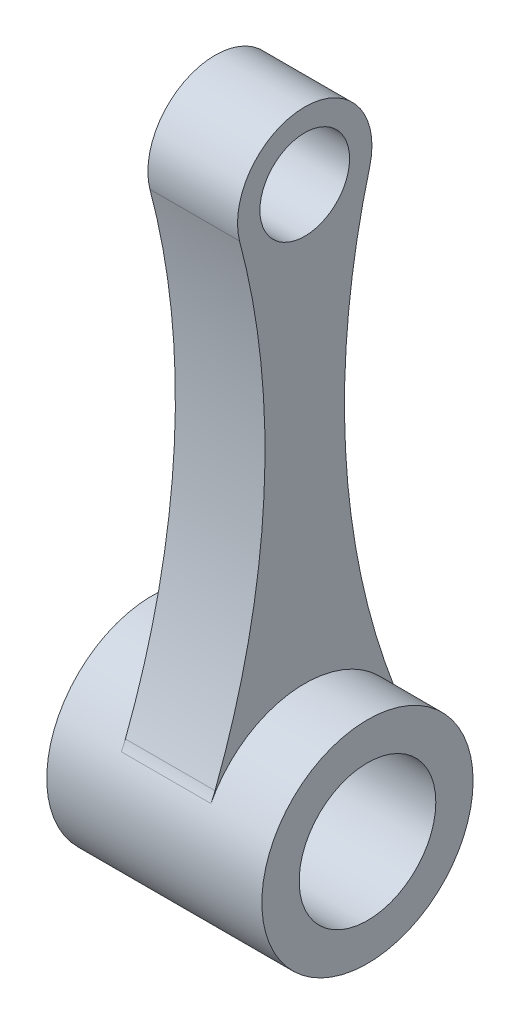
ISO-10303-21;
HEADER;
FILE_DESCRIPTION(('STEP AP214'),'2;1');
FILE_NAME('part.step','',(''),(''),'','','');
FILE_SCHEMA(('AUTOMOTIVE_DESIGN { 1 0 10303 214 1 1 1 1 }'));
ENDSEC;
DATA;
#1=APPLICATION_CONTEXT('core data for automotive mechanical design processes');
#2=APPLICATION_PROTOCOL_DEFINITION('international standard','automotive_design',2000,#1);
#3=PRODUCT_CONTEXT('',#1,'mechanical');
#4=PRODUCT('Part','Part','',(#3));
#5=PRODUCT_RELATED_PRODUCT_CATEGORY('part','',(#4));
#6=PRODUCT_DEFINITION_FORMATION('','',#4);
#7=PRODUCT_DEFINITION_CONTEXT('part definition',#1,'design');
#8=PRODUCT_DEFINITION('design','',#6,#7);
#9=PRODUCT_DEFINITION_SHAPE('','',#8);
#10=(LENGTH_UNIT() NAMED_UNIT(*) SI_UNIT(.MILLI.,.METRE.));
#11=(NAMED_UNIT(*) PLANE_ANGLE_UNIT() SI_UNIT($,.RADIAN.));
#12=(NAMED_UNIT(*) SI_UNIT($,.STERADIAN.) SOLID_ANGLE_UNIT());
#13=UNCERTAINTY_MEASURE_WITH_UNIT(LENGTH_MEASURE(1.E-05),#10,'distance_accuracy_value','');
#14=(GEOMETRIC_REPRESENTATION_CONTEXT(3) GLOBAL_UNCERTAINTY_ASSIGNED_CONTEXT((#13)) GLOBAL_UNIT_ASSIGNED_CONTEXT((#10,
#11,#12)) REPRESENTATION_CONTEXT('',''));
#15=CARTESIAN_POINT('',(0.,0.,0.));
#16=DIRECTION('',(0.,0.,1.));
#17=DIRECTION('',(1.,0.,0.));
#18=AXIS2_PLACEMENT_3D('',#15,#16,#17);
#19=CARTESIAN_POINT('',(12.,36.5210773560381,-88.4035011635025));
#20=DIRECTION('',(-1.,0.,0.));
#21=DIRECTION('',(0.,0.,1.));
#22=AXIS2_PLACEMENT_3D('',#19,#20,#21);
#23=CYLINDRICAL_SURFACE('',#22,83.9690692416678);
#24=DIRECTION('',(-1.,0.,0.));
#25=VECTOR('',#24,1.);
#26=CARTESIAN_POINT('',(12.,6.43103191721206,-10.010939304603));
#27=LINE('',#26,#25);
#28=CARTESIAN_POINT('',(5.,6.43103191721206,-10.010939304603));
#29=VERTEX_POINT('',#28);
#30=CARTESIAN_POINT('',(-5.,6.43103191721206,-10.010939304603));
#31=VERTEX_POINT('',#30);
#32=EDGE_CURVE('E111',#29,#31,#27,.T.);
#33=ORIENTED_EDGE('',*,*,#32,.T.);
#34=CARTESIAN_POINT('',(-5.,36.5210773560381,-88.4035011635025));
#35=DIRECTION('',(-1.,0.,0.));
#36=DIRECTION('',(0.,0.,1.));
#37=AXIS2_PLACEMENT_3D('',#34,#35,#36);
#38=CIRCLE('',#37,83.9690692416678);
#39=CARTESIAN_POINT('',(-5.,58.1783358251157,-7.27540649269463));
#40=VERTEX_POINT('',#39);
#41=EDGE_CURVE('E152',#40,#31,#38,.F.);
#42=ORIENTED_EDGE('',*,*,#41,.F.);
#43=DIRECTION('',(-1.,0.,0.));
#44=VECTOR('',#43,1.);
#45=CARTESIAN_POINT('',(12.,58.1783358251157,-7.27540649269463));
#46=LINE('',#45,#44);
#47=CARTESIAN_POINT('',(5.,58.1783358251157,-7.27540649269463));
#48=VERTEX_POINT('',#47);
#49=EDGE_CURVE('E114',#48,#40,#46,.T.);
#50=ORIENTED_EDGE('',*,*,#49,.F.);
#51=CARTESIAN_POINT('',(5.,36.5210773560381,-88.4035011635025));
#52=DIRECTION('',(1.,0.,0.));
#53=DIRECTION('',(0.,0.,-1.));
#54=AXIS2_PLACEMENT_3D('',#51,#52,#53);
#55=CIRCLE('',#54,83.9690692416678);
#56=EDGE_CURVE('E143',#29,#48,#55,.F.);
#57=ORIENTED_EDGE('',*,*,#56,.F.);
#58=EDGE_LOOP('',(#33,#42,#50,#57));
#59=FACE_BOUND('',#58,.T.);
#60=ADVANCED_FACE('F41',(#59),#23,.F.);
#61=CARTESIAN_POINT('',(12.,60.,0.));
#62=DIRECTION('',(-1.,0.,0.));
#63=DIRECTION('',(0.,0.,1.));
#64=AXIS2_PLACEMENT_3D('',#61,#62,#63);
#65=CYLINDRICAL_SURFACE('',#64,7.5);
#66=CARTESIAN_POINT('',(-5.,60.,0.));
#67=DIRECTION('',(-1.,0.,0.));
#68=DIRECTION('',(0.,0.,1.));
#69=AXIS2_PLACEMENT_3D('',#66,#67,#68);
#70=CIRCLE('',#69,7.5);
#71=CARTESIAN_POINT('',(-5.,58.1783358251157,7.27540649269463));
#72=VERTEX_POINT('',#71);
#73=EDGE_CURVE('E154',#72,#40,#70,.T.);
#74=ORIENTED_EDGE('',*,*,#73,.F.);
#75=DIRECTION('',(-1.,0.,0.));
#76=VECTOR('',#75,1.);
#77=CARTESIAN_POINT('',(12.,58.1783358251157,7.27540649269463));
#78=LINE('',#77,#76);
#79=CARTESIAN_POINT('',(5.,58.1783358251157,7.27540649269465));
#80=VERTEX_POINT('',#79);
#81=EDGE_CURVE('E119',#80,#72,#78,.T.);
#82=ORIENTED_EDGE('',*,*,#81,.F.);
#83=CARTESIAN_POINT('',(5.,60.,0.));
#84=DIRECTION('',(1.,0.,0.));
#85=DIRECTION('',(0.,0.,-1.));
#86=AXIS2_PLACEMENT_3D('',#83,#84,#85);
#87=CIRCLE('',#86,7.5);
#88=EDGE_CURVE('E141',#48,#80,#87,.T.);
#89=ORIENTED_EDGE('',*,*,#88,.F.);
#90=ORIENTED_EDGE('',*,*,#49,.T.);
#91=EDGE_LOOP('',(#74,#82,#89,#90));
#92=FACE_BOUND('',#91,.T.);
#93=ADVANCED_FACE('F160',(#92),#65,.T.);
#94=CARTESIAN_POINT('',(12.,36.5210773560381,88.4035011635025));
#95=DIRECTION('',(-1.,0.,0.));
#96=DIRECTION('',(0.,0.,1.));
#97=AXIS2_PLACEMENT_3D('',#94,#95,#96);
#98=CYLINDRICAL_SURFACE('',#97,83.9690692416678);
#99=CARTESIAN_POINT('',(-5.,36.5210773560381,88.4035011635025));
#100=DIRECTION('',(-1.,0.,0.));
#101=DIRECTION('',(0.,0.,1.));
#102=AXIS2_PLACEMENT_3D('',#99,#100,#101);
#103=CIRCLE('',#102,83.9690692416678);
#104=CARTESIAN_POINT('',(-5.,6.43103191721167,10.0109393046032));
#105=VERTEX_POINT('',#104);
#106=EDGE_CURVE('E107',#105,#72,#103,.F.);
#107=ORIENTED_EDGE('',*,*,#106,.F.);
#108=DIRECTION('',(-1.,0.,0.));
#109=VECTOR('',#108,1.);
#110=CARTESIAN_POINT('',(12.,6.43103191721168,10.0109393046032));
#111=LINE('',#110,#109);
#112=CARTESIAN_POINT('',(5.,6.43103191721168,10.0109393046032));
#113=VERTEX_POINT('',#112);
#114=EDGE_CURVE('E11',#105,#113,#111,.F.);
#115=ORIENTED_EDGE('',*,*,#114,.T.);
#116=CARTESIAN_POINT('',(5.,36.5210773560381,88.4035011635025));
#117=DIRECTION('',(1.,0.,0.));
#118=DIRECTION('',(0.,0.,-1.));
#119=AXIS2_PLACEMENT_3D('',#116,#117,#118);
#120=CIRCLE('',#119,83.9690692416678);
#121=EDGE_CURVE('E139',#80,#113,#120,.F.);
#122=ORIENTED_EDGE('',*,*,#121,.F.);
#123=ORIENTED_EDGE('',*,*,#81,.T.);
#124=EDGE_LOOP('',(#107,#115,#122,#123));
#125=FACE_BOUND('',#124,.T.);
#126=ADVANCED_FACE('F163',(#125),#98,.F.);
#127=CARTESIAN_POINT('',(12.,60.,0.));
#128=DIRECTION('',(-1.,0.,0.));
#129=DIRECTION('',(0.,0.,1.));
#130=AXIS2_PLACEMENT_3D('',#127,#128,#129);
#131=CYLINDRICAL_SURFACE('',#130,5.);
#132=CARTESIAN_POINT('',(5.,60.,0.));
#133=DIRECTION('',(1.,0.,0.));
#134=DIRECTION('',(0.,0.,-1.));
#135=AXIS2_PLACEMENT_3D('',#132,#133,#134);
#136=CIRCLE('',#135,5.);
#137=CARTESIAN_POINT('',(5.,60.,-5.));
#138=VERTEX_POINT('',#137);
#139=EDGE_CURVE('E134',#138,#138,#136,.F.);
#140=ORIENTED_EDGE('',*,*,#139,.F.);
#141=EDGE_LOOP('',(#140));
#142=FACE_BOUND('',#141,.T.);
#143=CARTESIAN_POINT('',(-5.,60.,0.));
#144=DIRECTION('',(-1.,0.,0.));
#145=DIRECTION('',(0.,0.,1.));
#146=AXIS2_PLACEMENT_3D('',#143,#144,#145);
#147=CIRCLE('',#146,5.);
#148=CARTESIAN_POINT('',(-5.,60.,5.));
#149=VERTEX_POINT('',#148);
#150=EDGE_CURVE('E148',#149,#149,#147,.F.);
#151=ORIENTED_EDGE('',*,*,#150,.F.);
#152=EDGE_LOOP('',(#151));
#153=FACE_BOUND('',#152,.T.);
#154=ADVANCED_FACE('F174',(#142,#153),#131,.F.);
#155=CARTESIAN_POINT('',(12.,10.0144997001197,-19.3468248356527));
#156=DIRECTION('',(-1.,0.,0.));
#157=DIRECTION('',(0.,0.,1.));
#158=AXIS2_PLACEMENT_3D('',#155,#156,#157);
#159=CYLINDRICAL_SURFACE('',#158,10.);
#160=CARTESIAN_POINT('',(-5.,10.0144997001197,-19.3468248356527));
#161=DIRECTION('',(-1.,0.,0.));
#162=DIRECTION('',(0.,0.,1.));
#163=AXIS2_PLACEMENT_3D('',#160,#161,#162);
#164=CIRCLE('',#163,10.);
#165=CARTESIAN_POINT('',(-5.,5.41754693117233,-10.4660576818496));
#166=VERTEX_POINT('',#165);
#167=EDGE_CURVE('E100',#31,#166,#164,.F.);
#168=ORIENTED_EDGE('',*,*,#167,.F.);
#169=ORIENTED_EDGE('',*,*,#32,.F.);
#170=CARTESIAN_POINT('',(5.,10.0144997001197,-19.3468248356527));
#171=DIRECTION('',(1.,0.,0.));
#172=DIRECTION('',(0.,0.,-1.));
#173=AXIS2_PLACEMENT_3D('',#170,#171,#172);
#174=CIRCLE('',#173,10.);
#175=CARTESIAN_POINT('',(5.,5.41754693117235,-10.4660576818497));
#176=VERTEX_POINT('',#175);
#177=EDGE_CURVE('E145',#176,#29,#174,.F.);
#178=ORIENTED_EDGE('',*,*,#177,.F.);
#179=DIRECTION('',(-1.,0.,0.));
#180=VECTOR('',#179,1.);
#181=CARTESIAN_POINT('',(12.,5.41754693117233,-10.4660576818496));
#182=LINE('',#181,#180);
#183=EDGE_CURVE('E49',#166,#176,#182,.F.);
#184=ORIENTED_EDGE('',*,*,#183,.F.);
#185=EDGE_LOOP('',(#168,#169,#178,#184));
#186=FACE_BOUND('',#185,.T.);
#187=ADVANCED_FACE('F171',(#186),#159,.F.);
#188=CARTESIAN_POINT('',(12.,10.0144997001194,19.3468248356528));
#189=DIRECTION('',(-1.,0.,0.));
#190=DIRECTION('',(0.,0.,1.));
#191=AXIS2_PLACEMENT_3D('',#188,#189,#190);
#192=CYLINDRICAL_SURFACE('',#191,10.);
#193=CARTESIAN_POINT('',(-5.,10.0144997001194,19.3468248356528));
#194=DIRECTION('',(-1.,0.,0.));
#195=DIRECTION('',(0.,0.,1.));
#196=AXIS2_PLACEMENT_3D('',#193,#194,#195);
#197=CIRCLE('',#196,10.);
#198=CARTESIAN_POINT('',(-5.,5.41754693117215,10.4660576818497));
#199=VERTEX_POINT('',#198);
#200=EDGE_CURVE('E98',#199,#105,#197,.F.);
#201=ORIENTED_EDGE('',*,*,#200,.F.);
#202=DIRECTION('',(-1.,0.,0.));
#203=VECTOR('',#202,1.);
#204=CARTESIAN_POINT('',(12.,5.41754693117216,10.4660576818497));
#205=LINE('',#204,#203);
#206=CARTESIAN_POINT('',(5.,5.41754693117216,10.4660576818497));
#207=VERTEX_POINT('',#206);
#208=EDGE_CURVE('E106',#207,#199,#205,.T.);
#209=ORIENTED_EDGE('',*,*,#208,.F.);
#210=CARTESIAN_POINT('',(5.,10.0144997001194,19.3468248356528));
#211=DIRECTION('',(1.,0.,0.));
#212=DIRECTION('',(0.,0.,-1.));
#213=AXIS2_PLACEMENT_3D('',#210,#211,#212);
#214=CIRCLE('',#213,10.);
#215=EDGE_CURVE('E137',#113,#207,#214,.F.);
#216=ORIENTED_EDGE('',*,*,#215,.F.);
#217=ORIENTED_EDGE('',*,*,#114,.F.);
#218=EDGE_LOOP('',(#201,#209,#216,#217));
#219=FACE_BOUND('',#218,.T.);
#220=ADVANCED_FACE('F43',(#219),#192,.F.);
#221=CARTESIAN_POINT('',(-12.,0.,0.));
#222=DIRECTION('',(1.,0.,0.));
#223=DIRECTION('',(0.,0.,-1.));
#224=AXIS2_PLACEMENT_3D('',#221,#222,#223);
#225=PLANE('',#224);
#226=CARTESIAN_POINT('',(-12.,0.,0.));
#227=DIRECTION('',(1.,0.,0.));
#228=DIRECTION('',(0.,0.,-1.));
#229=AXIS2_PLACEMENT_3D('',#226,#227,#228);
#230=CIRCLE('',#229,7.625);
#231=CARTESIAN_POINT('',(-12.,0.,-7.625));
#232=VERTEX_POINT('',#231);
#233=EDGE_CURVE('E128',#232,#232,#230,.T.);
#234=ORIENTED_EDGE('',*,*,#233,.T.);
#235=EDGE_LOOP('',(#234));
#236=FACE_BOUND('',#235,.T.);
#237=CARTESIAN_POINT('',(-12.,0.,0.));
#238=DIRECTION('',(1.,0.,0.));
#239=DIRECTION('',(0.,0.,-1.));
#240=AXIS2_PLACEMENT_3D('',#237,#238,#239);
#241=CIRCLE('',#240,11.7850828656933);
#242=CARTESIAN_POINT('',(-12.,0.,-11.7850828656933));
#243=VERTEX_POINT('',#242);
#244=EDGE_CURVE('E131',#243,#243,#241,.T.);
#245=ORIENTED_EDGE('',*,*,#244,.F.);
#246=EDGE_LOOP('',(#245));
#247=FACE_BOUND('',#246,.T.);
#248=ADVANCED_FACE('F179',(#236,#247),#225,.F.);
#249=CARTESIAN_POINT('',(12.,0.,0.));
#250=DIRECTION('',(1.,0.,0.));
#251=DIRECTION('',(0.,0.,-1.));
#252=AXIS2_PLACEMENT_3D('',#249,#250,#251);
#253=PLANE('',#252);
#254=CARTESIAN_POINT('',(12.,0.,0.));
#255=DIRECTION('',(1.,0.,0.));
#256=DIRECTION('',(0.,0.,-1.));
#257=AXIS2_PLACEMENT_3D('',#254,#255,#256);
#258=CIRCLE('',#257,7.625);
#259=CARTESIAN_POINT('',(12.,0.,-7.625));
#260=VERTEX_POINT('',#259);
#261=EDGE_CURVE('E122',#260,#260,#258,.T.);
#262=ORIENTED_EDGE('',*,*,#261,.F.);
#263=EDGE_LOOP('',(#262));
#264=FACE_BOUND('',#263,.T.);
#265=CARTESIAN_POINT('',(12.,0.,0.));
#266=DIRECTION('',(1.,0.,0.));
#267=DIRECTION('',(0.,0.,-1.));
#268=AXIS2_PLACEMENT_3D('',#265,#266,#267);
#269=CIRCLE('',#268,11.7850828656933);
#270=CARTESIAN_POINT('',(12.,0.,-11.7850828656933));
#271=VERTEX_POINT('',#270);
#272=EDGE_CURVE('E125',#271,#271,#269,.T.);
#273=ORIENTED_EDGE('',*,*,#272,.T.);
#274=EDGE_LOOP('',(#273));
#275=FACE_BOUND('',#274,.T.);
#276=ADVANCED_FACE('F195',(#264,#275),#253,.T.);
#277=CARTESIAN_POINT('',(12.,0.,0.));
#278=DIRECTION('',(-1.,0.,0.));
#279=DIRECTION('',(0.,0.,1.));
#280=AXIS2_PLACEMENT_3D('',#277,#278,#279);
#281=CYLINDRICAL_SURFACE('',#280,11.7850828656933);
#282=CARTESIAN_POINT('',(-5.,0.,0.));
#283=DIRECTION('',(-1.,0.,0.));
#284=DIRECTION('',(0.,0.,1.));
#285=AXIS2_PLACEMENT_3D('',#282,#283,#284);
#286=CIRCLE('',#285,11.7850828656933);
#287=EDGE_CURVE('E94',#199,#166,#286,.T.);
#288=ORIENTED_EDGE('',*,*,#287,.T.);
#289=ORIENTED_EDGE('',*,*,#183,.T.);
#290=CARTESIAN_POINT('',(5.,0.,0.));
#291=DIRECTION('',(1.,0.,0.));
#292=DIRECTION('',(0.,0.,-1.));
#293=AXIS2_PLACEMENT_3D('',#290,#291,#292);
#294=CIRCLE('',#293,11.7850828656933);
#295=EDGE_CURVE('E62',#176,#207,#294,.T.);
#296=ORIENTED_EDGE('',*,*,#295,.T.);
#297=ORIENTED_EDGE('',*,*,#208,.T.);
#298=EDGE_LOOP('',(#288,#289,#296,#297));
#299=FACE_BOUND('',#298,.T.);
#300=ORIENTED_EDGE('',*,*,#272,.F.);
#301=EDGE_LOOP('',(#300));
#302=FACE_BOUND('',#301,.T.);
#303=ORIENTED_EDGE('',*,*,#244,.T.);
#304=EDGE_LOOP('',(#303));
#305=FACE_BOUND('',#304,.T.);
#306=ADVANCED_FACE('F109',(#299,#302,#305),#281,.T.);
#307=CARTESIAN_POINT('',(12.,0.,0.));
#308=DIRECTION('',(-1.,0.,0.));
#309=DIRECTION('',(0.,0.,1.));
#310=AXIS2_PLACEMENT_3D('',#307,#308,#309);
#311=CYLINDRICAL_SURFACE('',#310,7.625);
#312=ORIENTED_EDGE('',*,*,#261,.T.);
#313=EDGE_LOOP('',(#312));
#314=FACE_BOUND('',#313,.T.);
#315=ORIENTED_EDGE('',*,*,#233,.F.);
#316=EDGE_LOOP('',(#315));
#317=FACE_BOUND('',#316,.T.);
#318=ADVANCED_FACE('F194',(#314,#317),#311,.F.);
#319=CARTESIAN_POINT('',(5.,0.,0.));
#320=DIRECTION('',(1.,0.,0.));
#321=DIRECTION('',(0.,0.,-1.));
#322=AXIS2_PLACEMENT_3D('',#319,#320,#321);
#323=PLANE('',#322);
#324=ORIENTED_EDGE('',*,*,#295,.F.);
#325=ORIENTED_EDGE('',*,*,#177,.T.);
#326=ORIENTED_EDGE('',*,*,#56,.T.);
#327=ORIENTED_EDGE('',*,*,#88,.T.);
#328=ORIENTED_EDGE('',*,*,#121,.T.);
#329=ORIENTED_EDGE('',*,*,#215,.T.);
#330=EDGE_LOOP('',(#324,#325,#326,#327,#328,#329));
#331=FACE_BOUND('',#330,.T.);
#332=ORIENTED_EDGE('',*,*,#139,.T.);
#333=EDGE_LOOP('',(#332));
#334=FACE_BOUND('',#333,.T.);
#335=ADVANCED_FACE('F165',(#331,#334),#323,.T.);
#336=CARTESIAN_POINT('',(-5.,0.,0.));
#337=DIRECTION('',(-1.,0.,0.));
#338=DIRECTION('',(0.,0.,1.));
#339=AXIS2_PLACEMENT_3D('',#336,#337,#338);
#340=PLANE('',#339);
#341=ORIENTED_EDGE('',*,*,#287,.F.);
#342=ORIENTED_EDGE('',*,*,#200,.T.);
#343=ORIENTED_EDGE('',*,*,#106,.T.);
#344=ORIENTED_EDGE('',*,*,#73,.T.);
#345=ORIENTED_EDGE('',*,*,#41,.T.);
#346=ORIENTED_EDGE('',*,*,#167,.T.);
#347=EDGE_LOOP('',(#341,#342,#343,#344,#345,#346));
#348=FACE_BOUND('',#347,.T.);
#349=ORIENTED_EDGE('',*,*,#150,.T.);
#350=EDGE_LOOP('',(#349));
#351=FACE_BOUND('',#350,.T.);
#352=ADVANCED_FACE('F96',(#348,#351),#340,.T.);
#353=CLOSED_SHELL('',(#60,#93,#126,#154,#187,#220,#248,#276,#306,#318,#335,#352));
#354=MANIFOLD_SOLID_BREP('B2',#353);
#355=ADVANCED_BREP_SHAPE_REPRESENTATION('',(#18,#354),#14);
#356=SHAPE_DEFINITION_REPRESENTATION(#9,#355);
ENDSEC;
END-ISO-10303-21;
